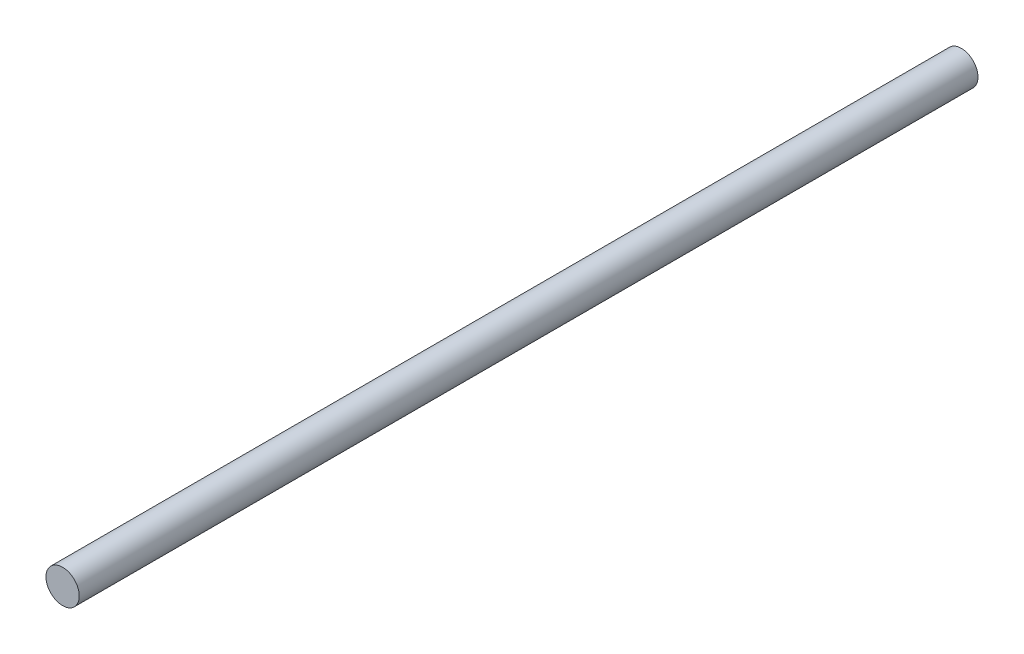
ISO-10303-21;
HEADER;
FILE_DESCRIPTION(('STEP AP214'),'2;1');
FILE_NAME('part.step','',(''),(''),'','','');
FILE_SCHEMA(('AUTOMOTIVE_DESIGN { 1 0 10303 214 1 1 1 1 }'));
ENDSEC;
DATA;
#1=APPLICATION_CONTEXT('core data for automotive mechanical design processes');
#2=APPLICATION_PROTOCOL_DEFINITION('international standard','automotive_design',2000,#1);
#3=PRODUCT_CONTEXT('',#1,'mechanical');
#4=PRODUCT('Part','Part','',(#3));
#5=PRODUCT_RELATED_PRODUCT_CATEGORY('part','',(#4));
#6=PRODUCT_DEFINITION_FORMATION('','',#4);
#7=PRODUCT_DEFINITION_CONTEXT('part definition',#1,'design');
#8=PRODUCT_DEFINITION('design','',#6,#7);
#9=PRODUCT_DEFINITION_SHAPE('','',#8);
#10=(LENGTH_UNIT() NAMED_UNIT(*) SI_UNIT(.MILLI.,.METRE.));
#11=(NAMED_UNIT(*) PLANE_ANGLE_UNIT() SI_UNIT($,.RADIAN.));
#12=(NAMED_UNIT(*) SI_UNIT($,.STERADIAN.) SOLID_ANGLE_UNIT());
#13=UNCERTAINTY_MEASURE_WITH_UNIT(LENGTH_MEASURE(1.E-05),#10,'distance_accuracy_value','');
#14=(GEOMETRIC_REPRESENTATION_CONTEXT(3) GLOBAL_UNCERTAINTY_ASSIGNED_CONTEXT((#13)) GLOBAL_UNIT_ASSIGNED_CONTEXT((#10,
#11,#12)) REPRESENTATION_CONTEXT('',''));
#15=CARTESIAN_POINT('',(0.,0.,0.));
#16=DIRECTION('',(0.,0.,1.));
#17=DIRECTION('',(1.,0.,0.));
#18=AXIS2_PLACEMENT_3D('',#15,#16,#17);
#19=CARTESIAN_POINT('',(0.,0.,162.));
#20=DIRECTION('',(0.,0.,-1.));
#21=DIRECTION('',(-1.,0.,0.));
#22=AXIS2_PLACEMENT_3D('',#19,#20,#21);
#23=CYLINDRICAL_SURFACE('',#22,3.);
#24=CARTESIAN_POINT('',(0.,0.,162.));
#25=DIRECTION('',(0.,0.,1.));
#26=DIRECTION('',(1.,0.,0.));
#27=AXIS2_PLACEMENT_3D('',#24,#25,#26);
#28=CIRCLE('',#27,3.);
#29=CARTESIAN_POINT('',(3.,0.,162.));
#30=VERTEX_POINT('',#29);
#31=EDGE_CURVE('E10',#30,#30,#28,.T.);
#32=ORIENTED_EDGE('',*,*,#31,.F.);
#33=EDGE_LOOP('',(#32));
#34=FACE_BOUND('',#33,.T.);
#35=CARTESIAN_POINT('',(0.,0.,0.));
#36=DIRECTION('',(0.,0.,1.));
#37=DIRECTION('',(1.,0.,0.));
#38=AXIS2_PLACEMENT_3D('',#35,#36,#37);
#39=CIRCLE('',#38,3.);
#40=CARTESIAN_POINT('',(3.,0.,0.));
#41=VERTEX_POINT('',#40);
#42=EDGE_CURVE('E40',#41,#41,#39,.T.);
#43=ORIENTED_EDGE('',*,*,#42,.T.);
#44=EDGE_LOOP('',(#43));
#45=FACE_BOUND('',#44,.T.);
#46=ADVANCED_FACE('F37',(#34,#45),#23,.T.);
#47=CARTESIAN_POINT('',(0.,0.,162.));
#48=DIRECTION('',(0.,0.,1.));
#49=DIRECTION('',(1.,0.,0.));
#50=AXIS2_PLACEMENT_3D('',#47,#48,#49);
#51=PLANE('',#50);
#52=ORIENTED_EDGE('',*,*,#31,.T.);
#53=EDGE_LOOP('',(#52));
#54=FACE_BOUND('',#53,.T.);
#55=ADVANCED_FACE('F54',(#54),#51,.T.);
#56=CARTESIAN_POINT('',(0.,0.,0.));
#57=DIRECTION('',(0.,0.,1.));
#58=DIRECTION('',(1.,0.,0.));
#59=AXIS2_PLACEMENT_3D('',#56,#57,#58);
#60=PLANE('',#59);
#61=ORIENTED_EDGE('',*,*,#42,.F.);
#62=EDGE_LOOP('',(#61));
#63=FACE_BOUND('',#62,.T.);
#64=ADVANCED_FACE('F52',(#63),#60,.F.);
#65=CLOSED_SHELL('',(#46,#55,#64));
#66=MANIFOLD_SOLID_BREP('B2',#65);
#67=ADVANCED_BREP_SHAPE_REPRESENTATION('',(#18,#66),#14);
#68=SHAPE_DEFINITION_REPRESENTATION(#9,#67);
ENDSEC;
END-ISO-10303-21;
